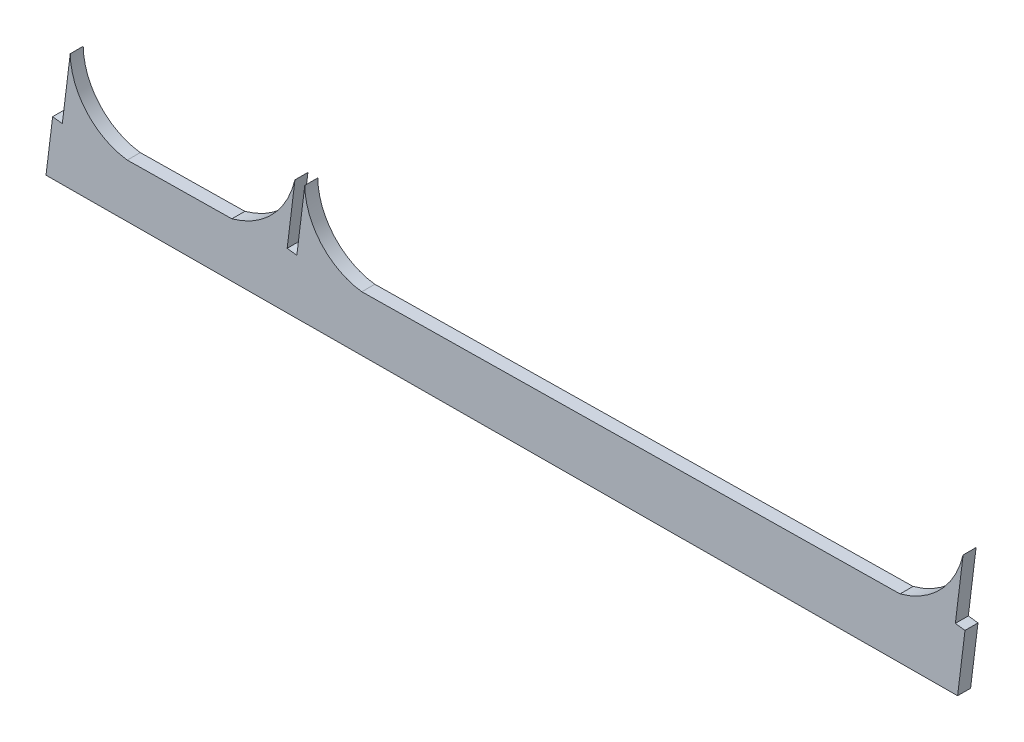
ISO-10303-21;
HEADER;
FILE_DESCRIPTION(('STEP AP214'),'2;1');
FILE_NAME('part.step','',(''),(''),'','','');
FILE_SCHEMA(('AUTOMOTIVE_DESIGN { 1 0 10303 214 1 1 1 1 }'));
ENDSEC;
DATA;
#1=APPLICATION_CONTEXT('core data for automotive mechanical design processes');
#2=APPLICATION_PROTOCOL_DEFINITION('international standard','automotive_design',2000,#1);
#3=PRODUCT_CONTEXT('',#1,'mechanical');
#4=PRODUCT('Part','Part','',(#3));
#5=PRODUCT_RELATED_PRODUCT_CATEGORY('part','',(#4));
#6=PRODUCT_DEFINITION_FORMATION('','',#4);
#7=PRODUCT_DEFINITION_CONTEXT('part definition',#1,'design');
#8=PRODUCT_DEFINITION('design','',#6,#7);
#9=PRODUCT_DEFINITION_SHAPE('','',#8);
#10=(LENGTH_UNIT() NAMED_UNIT(*) SI_UNIT(.MILLI.,.METRE.));
#11=(NAMED_UNIT(*) PLANE_ANGLE_UNIT() SI_UNIT($,.RADIAN.));
#12=(NAMED_UNIT(*) SI_UNIT($,.STERADIAN.) SOLID_ANGLE_UNIT());
#13=UNCERTAINTY_MEASURE_WITH_UNIT(LENGTH_MEASURE(1.E-05),#10,'distance_accuracy_value','');
#14=(GEOMETRIC_REPRESENTATION_CONTEXT(3) GLOBAL_UNCERTAINTY_ASSIGNED_CONTEXT((#13)) GLOBAL_UNIT_ASSIGNED_CONTEXT((#10,
#11,#12)) REPRESENTATION_CONTEXT('',''));
#15=CARTESIAN_POINT('',(0.,0.,0.));
#16=DIRECTION('',(0.,0.,1.));
#17=DIRECTION('',(1.,0.,0.));
#18=AXIS2_PLACEMENT_3D('',#15,#16,#17);
#19=CARTESIAN_POINT('',(27.4838400064507,26.7019259834383,2.));
#20=DIRECTION('',(0.,0.,-1.));
#21=DIRECTION('',(-1.,0.,0.));
#22=AXIS2_PLACEMENT_3D('',#19,#20,#21);
#23=CYLINDRICAL_SURFACE('',#22,9.9999999999998);
#24=CARTESIAN_POINT('',(27.4838400064507,26.7019259834383,0.));
#25=DIRECTION('',(0.,0.,-1.));
#26=DIRECTION('',(1.,0.,0.));
#27=AXIS2_PLACEMENT_3D('',#24,#25,#26);
#28=CIRCLE('',#27,9.9999999999998);
#29=CARTESIAN_POINT('',(26.2651465723992,16.7764644670253,0.));
#30=VERTEX_POINT('',#29);
#31=CARTESIAN_POINT('',(17.4847943354508,26.5637750903717,0.));
#32=VERTEX_POINT('',#31);
#33=EDGE_CURVE('E177',#30,#32,#28,.T.);
#34=ORIENTED_EDGE('',*,*,#33,.T.);
#35=DIRECTION('',(0.,0.,-1.));
#36=VECTOR('',#35,1.);
#37=CARTESIAN_POINT('',(17.4847943354508,26.5637750903717,2.));
#38=LINE('',#37,#36);
#39=CARTESIAN_POINT('',(17.4847943354508,26.5637750903717,2.));
#40=VERTEX_POINT('',#39);
#41=EDGE_CURVE('E11',#40,#32,#38,.T.);
#42=ORIENTED_EDGE('',*,*,#41,.F.);
#43=CARTESIAN_POINT('',(27.4838400064507,26.7019259834383,2.));
#44=DIRECTION('',(0.,0.,-1.));
#45=DIRECTION('',(1.,0.,0.));
#46=AXIS2_PLACEMENT_3D('',#43,#44,#45);
#47=CIRCLE('',#46,9.9999999999998);
#48=CARTESIAN_POINT('',(26.2651465723992,16.7764644670253,2.));
#49=VERTEX_POINT('',#48);
#50=EDGE_CURVE('E207',#49,#40,#47,.T.);
#51=ORIENTED_EDGE('',*,*,#50,.F.);
#52=DIRECTION('',(0.,0.,-1.));
#53=VECTOR('',#52,1.);
#54=CARTESIAN_POINT('',(26.2651465723992,16.7764644670253,2.));
#55=LINE('',#54,#53);
#56=EDGE_CURVE('E173',#49,#30,#55,.T.);
#57=ORIENTED_EDGE('',*,*,#56,.T.);
#58=EDGE_LOOP('',(#34,#42,#51,#57));
#59=FACE_BOUND('',#58,.T.);
#60=ADVANCED_FACE('F33',(#59),#23,.F.);
#61=CARTESIAN_POINT('',(17.4847943354508,26.5637750903717,2.));
#62=DIRECTION('',(0.992546151641322,-0.121869343405149,0.));
#63=DIRECTION('',(0.121869343405149,0.992546151641322,0.));
#64=AXIS2_PLACEMENT_3D('',#61,#62,#63);
#65=PLANE('',#64);
#66=DIRECTION('',(-0.121869343405149,-0.992546151641322,0.));
#67=VECTOR('',#66,1.);
#68=CARTESIAN_POINT('',(17.4847943354508,26.5637750903717,0.));
#69=LINE('',#68,#67);
#70=CARTESIAN_POINT('',(16.2661009013993,16.6383135739585,0.));
#71=VERTEX_POINT('',#70);
#72=EDGE_CURVE('E180',#32,#71,#69,.T.);
#73=ORIENTED_EDGE('',*,*,#72,.T.);
#74=DIRECTION('',(0.,0.,-1.));
#75=VECTOR('',#74,1.);
#76=CARTESIAN_POINT('',(16.2661009013993,16.6383135739585,2.));
#77=LINE('',#76,#75);
#78=CARTESIAN_POINT('',(16.2661009013993,16.6383135739585,2.));
#79=VERTEX_POINT('',#78);
#80=EDGE_CURVE('E41',#79,#71,#77,.T.);
#81=ORIENTED_EDGE('',*,*,#80,.F.);
#82=DIRECTION('',(-0.121869343405149,-0.992546151641322,0.));
#83=VECTOR('',#82,1.);
#84=CARTESIAN_POINT('',(17.4847943354508,26.5637750903717,2.));
#85=LINE('',#84,#83);
#86=EDGE_CURVE('E116',#40,#79,#85,.T.);
#87=ORIENTED_EDGE('',*,*,#86,.F.);
#88=ORIENTED_EDGE('',*,*,#41,.T.);
#89=EDGE_LOOP('',(#73,#81,#87,#88));
#90=FACE_BOUND('',#89,.T.);
#91=ADVANCED_FACE('F305',(#90),#65,.F.);
#92=CARTESIAN_POINT('',(16.2661009013993,16.6383135739585,2.));
#93=DIRECTION('',(-0.121869343405697,-0.992546151641255,0.));
#94=DIRECTION('',(0.992546151641255,-0.121869343405697,0.));
#95=AXIS2_PLACEMENT_3D('',#92,#93,#94);
#96=PLANE('',#95);
#97=DIRECTION('',(-0.992546151641255,0.121869343405697,0.));
#98=VECTOR('',#97,1.);
#99=CARTESIAN_POINT('',(16.2661009013993,16.6383135739585,0.));
#100=LINE('',#99,#98);
#101=CARTESIAN_POINT('',(14.7772816739373,16.8211175890671,0.));
#102=VERTEX_POINT('',#101);
#103=EDGE_CURVE('E182',#71,#102,#100,.T.);
#104=ORIENTED_EDGE('',*,*,#103,.T.);
#105=DIRECTION('',(0.,0.,-1.));
#106=VECTOR('',#105,1.);
#107=CARTESIAN_POINT('',(14.7772816739373,16.8211175890671,2.));
#108=LINE('',#107,#106);
#109=CARTESIAN_POINT('',(14.7772816739373,16.8211175890671,2.));
#110=VERTEX_POINT('',#109);
#111=EDGE_CURVE('E238',#110,#102,#108,.T.);
#112=ORIENTED_EDGE('',*,*,#111,.F.);
#113=DIRECTION('',(-0.992546151641255,0.121869343405697,0.));
#114=VECTOR('',#113,1.);
#115=CARTESIAN_POINT('',(16.2661009013993,16.6383135739585,2.));
#116=LINE('',#115,#114);
#117=EDGE_CURVE('E246',#79,#110,#116,.T.);
#118=ORIENTED_EDGE('',*,*,#117,.F.);
#119=ORIENTED_EDGE('',*,*,#80,.T.);
#120=EDGE_LOOP('',(#104,#112,#118,#119));
#121=FACE_BOUND('',#120,.T.);
#122=ADVANCED_FACE('F244',(#121),#96,.F.);
#123=CARTESIAN_POINT('',(14.7772816739373,16.8211175890671,2.));
#124=DIRECTION('',(0.992546151641322,-0.121869343405147,0.));
#125=DIRECTION('',(0.121869343405147,0.992546151641322,0.));
#126=AXIS2_PLACEMENT_3D('',#123,#124,#125);
#127=PLANE('',#126);
#128=DIRECTION('',(-0.121869343405147,-0.992546151641322,0.));
#129=VECTOR('',#128,1.);
#130=CARTESIAN_POINT('',(14.7772816739373,16.8211175890671,0.));
#131=LINE('',#130,#129);
#132=CARTESIAN_POINT('',(13.7561380350708,8.50457004141588,0.));
#133=VERTEX_POINT('',#132);
#134=EDGE_CURVE('E184',#102,#133,#131,.T.);
#135=ORIENTED_EDGE('',*,*,#134,.T.);
#136=DIRECTION('',(0.,0.,-1.));
#137=VECTOR('',#136,1.);
#138=CARTESIAN_POINT('',(13.7561380350708,8.50457004141588,2.));
#139=LINE('',#138,#137);
#140=CARTESIAN_POINT('',(13.7561380350708,8.50457004141588,2.));
#141=VERTEX_POINT('',#140);
#142=EDGE_CURVE('E235',#141,#133,#139,.T.);
#143=ORIENTED_EDGE('',*,*,#142,.F.);
#144=DIRECTION('',(-0.121869343405147,-0.992546151641322,0.));
#145=VECTOR('',#144,1.);
#146=CARTESIAN_POINT('',(14.7772816739373,16.8211175890671,2.));
#147=LINE('',#146,#145);
#148=EDGE_CURVE('E264',#110,#141,#147,.T.);
#149=ORIENTED_EDGE('',*,*,#148,.F.);
#150=ORIENTED_EDGE('',*,*,#111,.T.);
#151=EDGE_LOOP('',(#135,#143,#149,#150));
#152=FACE_BOUND('',#151,.T.);
#153=ADVANCED_FACE('F255',(#152),#127,.F.);
#154=CARTESIAN_POINT('',(13.7561380350708,8.50457004141588,2.));
#155=DIRECTION('',(-0.00545790160296681,0.999985105544124,0.));
#156=DIRECTION('',(-0.999985105544124,-0.00545790160296681,0.));
#157=AXIS2_PLACEMENT_3D('',#154,#155,#156);
#158=PLANE('',#157);
#159=DIRECTION('',(0.999985105544124,0.00545790160296681,0.));
#160=VECTOR('',#159,1.);
#161=CARTESIAN_POINT('',(13.7561380350708,8.50457004141588,0.));
#162=LINE('',#161,#160);
#163=CARTESIAN_POINT('',(154.085282897782,9.27048411397839,0.));
#164=VERTEX_POINT('',#163);
#165=EDGE_CURVE('E186',#133,#164,#162,.T.);
#166=ORIENTED_EDGE('',*,*,#165,.T.);
#167=DIRECTION('',(0.,0.,-1.));
#168=VECTOR('',#167,1.);
#169=CARTESIAN_POINT('',(154.085282897782,9.27048411397839,2.));
#170=LINE('',#169,#168);
#171=CARTESIAN_POINT('',(154.085282897782,9.27048411397839,2.));
#172=VERTEX_POINT('',#171);
#173=EDGE_CURVE('E232',#172,#164,#170,.T.);
#174=ORIENTED_EDGE('',*,*,#173,.F.);
#175=DIRECTION('',(0.999985105544124,0.00545790160296681,0.));
#176=VECTOR('',#175,1.);
#177=CARTESIAN_POINT('',(13.7561380350708,8.50457004141588,2.));
#178=LINE('',#177,#176);
#179=EDGE_CURVE('E261',#141,#172,#178,.T.);
#180=ORIENTED_EDGE('',*,*,#179,.F.);
#181=ORIENTED_EDGE('',*,*,#142,.T.);
#182=EDGE_LOOP('',(#166,#174,#180,#181));
#183=FACE_BOUND('',#182,.T.);
#184=ADVANCED_FACE('F259',(#183),#158,.F.);
#185=CARTESIAN_POINT('',(155.225675401659,18.5582357294194,2.));
#186=DIRECTION('',(-0.992546151641323,0.121869343405143,0.));
#187=DIRECTION('',(-0.121869343405143,-0.992546151641323,0.));
#188=AXIS2_PLACEMENT_3D('',#185,#186,#187);
#189=PLANE('',#188);
#190=DIRECTION('',(0.121869343405143,0.992546151641323,0.));
#191=VECTOR('',#190,1.);
#192=CARTESIAN_POINT('',(155.225675401659,18.5582357294194,0.));
#193=LINE('',#192,#191);
#194=CARTESIAN_POINT('',(155.225675401659,18.5582357294194,0.));
#195=VERTEX_POINT('',#194);
#196=EDGE_CURVE('E188',#164,#195,#193,.T.);
#197=ORIENTED_EDGE('',*,*,#196,.T.);
#198=DIRECTION('',(0.,0.,-1.));
#199=VECTOR('',#198,1.);
#200=CARTESIAN_POINT('',(155.225675401659,18.5582357294194,2.));
#201=LINE('',#200,#199);
#202=CARTESIAN_POINT('',(155.225675401659,18.5582357294194,2.));
#203=VERTEX_POINT('',#202);
#204=EDGE_CURVE('E229',#203,#195,#201,.T.);
#205=ORIENTED_EDGE('',*,*,#204,.F.);
#206=DIRECTION('',(0.121869343405143,0.992546151641323,0.));
#207=VECTOR('',#206,1.);
#208=CARTESIAN_POINT('',(155.225675401659,18.5582357294194,2.));
#209=LINE('',#208,#207);
#210=EDGE_CURVE('E263',#172,#203,#209,.T.);
#211=ORIENTED_EDGE('',*,*,#210,.F.);
#212=ORIENTED_EDGE('',*,*,#173,.T.);
#213=EDGE_LOOP('',(#197,#205,#211,#212));
#214=FACE_BOUND('',#213,.T.);
#215=ADVANCED_FACE('F318',(#214),#189,.F.);
#216=CARTESIAN_POINT('',(155.225675401659,18.5582357294194,2.));
#217=DIRECTION('',(-0.121869343405157,-0.992546151641321,0.));
#218=DIRECTION('',(0.992546151641321,-0.121869343405157,0.));
#219=AXIS2_PLACEMENT_3D('',#216,#217,#218);
#220=PLANE('',#219);
#221=DIRECTION('',(-0.992546151641321,0.121869343405157,0.));
#222=VECTOR('',#221,1.);
#223=CARTESIAN_POINT('',(155.225675401659,18.5582357294194,0.));
#224=LINE('',#223,#222);
#225=CARTESIAN_POINT('',(153.736856174199,18.7410397445269,0.));
#226=VERTEX_POINT('',#225);
#227=EDGE_CURVE('E190',#195,#226,#224,.T.);
#228=ORIENTED_EDGE('',*,*,#227,.T.);
#229=DIRECTION('',(0.,0.,-1.));
#230=VECTOR('',#229,1.);
#231=CARTESIAN_POINT('',(153.736856174199,18.7410397445269,2.));
#232=LINE('',#231,#230);
#233=CARTESIAN_POINT('',(153.736856174199,18.7410397445269,2.));
#234=VERTEX_POINT('',#233);
#235=EDGE_CURVE('E226',#234,#226,#232,.T.);
#236=ORIENTED_EDGE('',*,*,#235,.F.);
#237=DIRECTION('',(-0.992546151641321,0.121869343405157,0.));
#238=VECTOR('',#237,1.);
#239=CARTESIAN_POINT('',(155.225675401659,18.5582357294194,2.));
#240=LINE('',#239,#238);
#241=EDGE_CURVE('E266',#203,#234,#240,.T.);
#242=ORIENTED_EDGE('',*,*,#241,.F.);
#243=ORIENTED_EDGE('',*,*,#204,.T.);
#244=EDGE_LOOP('',(#228,#236,#242,#243));
#245=FACE_BOUND('',#244,.T.);
#246=ADVANCED_FACE('F321',(#245),#220,.F.);
#247=CARTESIAN_POINT('',(154.930535968518,28.4627815135302,2.));
#248=DIRECTION('',(-0.992546151641322,0.121869343405151,0.));
#249=DIRECTION('',(-0.121869343405151,-0.992546151641322,0.));
#250=AXIS2_PLACEMENT_3D('',#247,#248,#249);
#251=PLANE('',#250);
#252=DIRECTION('',(0.121869343405151,0.992546151641322,0.));
#253=VECTOR('',#252,1.);
#254=CARTESIAN_POINT('',(154.930535968518,28.4627815135302,0.));
#255=LINE('',#254,#253);
#256=CARTESIAN_POINT('',(154.930535968518,28.4627815135302,0.));
#257=VERTEX_POINT('',#256);
#258=EDGE_CURVE('E192',#226,#257,#255,.T.);
#259=ORIENTED_EDGE('',*,*,#258,.T.);
#260=DIRECTION('',(0.,0.,-1.));
#261=VECTOR('',#260,1.);
#262=CARTESIAN_POINT('',(154.930535968518,28.4627815135302,2.));
#263=LINE('',#262,#261);
#264=CARTESIAN_POINT('',(154.930535968518,28.4627815135302,2.));
#265=VERTEX_POINT('',#264);
#266=EDGE_CURVE('E223',#265,#257,#263,.T.);
#267=ORIENTED_EDGE('',*,*,#266,.F.);
#268=DIRECTION('',(0.121869343405151,0.992546151641322,0.));
#269=VECTOR('',#268,1.);
#270=CARTESIAN_POINT('',(154.930535968518,28.4627815135302,2.));
#271=LINE('',#270,#269);
#272=EDGE_CURVE('E272',#234,#265,#271,.T.);
#273=ORIENTED_EDGE('',*,*,#272,.F.);
#274=ORIENTED_EDGE('',*,*,#235,.T.);
#275=EDGE_LOOP('',(#259,#267,#273,#274));
#276=FACE_BOUND('',#275,.T.);
#277=ADVANCED_FACE('F325',(#276),#251,.F.);
#278=CARTESIAN_POINT('',(141.610831824647,31.6235245626371,2.));
#279=DIRECTION('',(0.,0.,-1.));
#280=DIRECTION('',(-1.,0.,0.));
#281=AXIS2_PLACEMENT_3D('',#278,#279,#280);
#282=CYLINDRICAL_SURFACE('',#281,13.6895878353855);
#283=CARTESIAN_POINT('',(141.610831824647,31.6235245626371,0.));
#284=DIRECTION('',(0.,0.,-1.));
#285=DIRECTION('',(1.,0.,0.));
#286=AXIS2_PLACEMENT_3D('',#283,#284,#285);
#287=CIRCLE('',#286,13.6895878353855);
#288=CARTESIAN_POINT('',(145.226629730662,18.4200848363541,0.));
#289=VERTEX_POINT('',#288);
#290=EDGE_CURVE('E194',#257,#289,#287,.T.);
#291=ORIENTED_EDGE('',*,*,#290,.T.);
#292=DIRECTION('',(0.,0.,-1.));
#293=VECTOR('',#292,1.);
#294=CARTESIAN_POINT('',(145.226629730662,18.4200848363541,2.));
#295=LINE('',#294,#293);
#296=CARTESIAN_POINT('',(145.226629730662,18.4200848363541,2.));
#297=VERTEX_POINT('',#296);
#298=EDGE_CURVE('E220',#297,#289,#295,.T.);
#299=ORIENTED_EDGE('',*,*,#298,.F.);
#300=CARTESIAN_POINT('',(141.610831824647,31.6235245626371,2.));
#301=DIRECTION('',(0.,0.,-1.));
#302=DIRECTION('',(1.,0.,0.));
#303=AXIS2_PLACEMENT_3D('',#300,#301,#302);
#304=CIRCLE('',#303,13.6895878353855);
#305=EDGE_CURVE('E274',#265,#297,#304,.T.);
#306=ORIENTED_EDGE('',*,*,#305,.F.);
#307=ORIENTED_EDGE('',*,*,#266,.T.);
#308=EDGE_LOOP('',(#291,#299,#306,#307));
#309=FACE_BOUND('',#308,.T.);
#310=ADVANCED_FACE('F329',(#309),#282,.F.);
#311=CARTESIAN_POINT('',(62.3697126579389,17.2752998771804,2.));
#312=DIRECTION('',(0.0138150893065506,-0.999904567100007,0.));
#313=DIRECTION('',(0.999904567100007,0.0138150893065506,0.));
#314=AXIS2_PLACEMENT_3D('',#311,#312,#313);
#315=PLANE('',#314);
#316=DIRECTION('',(-0.999904567100007,-0.0138150893065506,0.));
#317=VECTOR('',#316,1.);
#318=CARTESIAN_POINT('',(62.3697126579389,17.2752998771804,0.));
#319=LINE('',#318,#317);
#320=CARTESIAN_POINT('',(62.3697126579389,17.2752998771804,0.));
#321=VERTEX_POINT('',#320);
#322=EDGE_CURVE('E196',#289,#321,#319,.T.);
#323=ORIENTED_EDGE('',*,*,#322,.T.);
#324=DIRECTION('',(0.,0.,-1.));
#325=VECTOR('',#324,1.);
#326=CARTESIAN_POINT('',(62.3697126579389,17.2752998771804,2.));
#327=LINE('',#326,#325);
#328=CARTESIAN_POINT('',(62.3697126579389,17.2752998771804,2.));
#329=VERTEX_POINT('',#328);
#330=EDGE_CURVE('E217',#329,#321,#327,.T.);
#331=ORIENTED_EDGE('',*,*,#330,.F.);
#332=DIRECTION('',(-0.999904567100007,-0.0138150893065506,0.));
#333=VECTOR('',#332,1.);
#334=CARTESIAN_POINT('',(62.3697126579389,17.2752998771804,2.));
#335=LINE('',#334,#333);
#336=EDGE_CURVE('E276',#297,#329,#335,.T.);
#337=ORIENTED_EDGE('',*,*,#336,.F.);
#338=ORIENTED_EDGE('',*,*,#298,.T.);
#339=EDGE_LOOP('',(#323,#331,#337,#338));
#340=FACE_BOUND('',#339,.T.);
#341=ADVANCED_FACE('F333',(#340),#315,.F.);
#342=CARTESIAN_POINT('',(63.5884060919903,27.2007613935934,2.));
#343=DIRECTION('',(0.,0.,-1.));
#344=DIRECTION('',(-1.,0.,0.));
#345=AXIS2_PLACEMENT_3D('',#342,#343,#344);
#346=CYLINDRICAL_SURFACE('',#345,9.9999999999998);
#347=CARTESIAN_POINT('',(63.5884060919903,27.2007613935934,0.));
#348=DIRECTION('',(0.,0.,-1.));
#349=DIRECTION('',(1.,0.,0.));
#350=AXIS2_PLACEMENT_3D('',#347,#348,#349);
#351=CIRCLE('',#350,9.9999999999998);
#352=CARTESIAN_POINT('',(53.5893604209905,27.0626105005269,0.));
#353=VERTEX_POINT('',#352);
#354=EDGE_CURVE('E198',#321,#353,#351,.T.);
#355=ORIENTED_EDGE('',*,*,#354,.T.);
#356=DIRECTION('',(0.,0.,-1.));
#357=VECTOR('',#356,1.);
#358=CARTESIAN_POINT('',(53.5893604209905,27.0626105005269,2.));
#359=LINE('',#358,#357);
#360=CARTESIAN_POINT('',(53.5893604209905,27.0626105005269,2.));
#361=VERTEX_POINT('',#360);
#362=EDGE_CURVE('E214',#361,#353,#359,.T.);
#363=ORIENTED_EDGE('',*,*,#362,.F.);
#364=CARTESIAN_POINT('',(63.5884060919903,27.2007613935934,2.));
#365=DIRECTION('',(0.,0.,-1.));
#366=DIRECTION('',(1.,0.,0.));
#367=AXIS2_PLACEMENT_3D('',#364,#365,#366);
#368=CIRCLE('',#367,9.9999999999998);
#369=EDGE_CURVE('E278',#329,#361,#368,.T.);
#370=ORIENTED_EDGE('',*,*,#369,.F.);
#371=ORIENTED_EDGE('',*,*,#330,.T.);
#372=EDGE_LOOP('',(#355,#363,#370,#371));
#373=FACE_BOUND('',#372,.T.);
#374=ADVANCED_FACE('F337',(#373),#346,.F.);
#375=CARTESIAN_POINT('',(53.5893604209905,27.0626105005269,2.));
#376=DIRECTION('',(0.992546151641322,-0.121869343405149,0.));
#377=DIRECTION('',(0.121869343405149,0.992546151641322,0.));
#378=AXIS2_PLACEMENT_3D('',#375,#376,#377);
#379=PLANE('',#378);
#380=DIRECTION('',(-0.121869343405149,-0.992546151641322,0.));
#381=VECTOR('',#380,1.);
#382=CARTESIAN_POINT('',(53.5893604209905,27.0626105005269,0.));
#383=LINE('',#382,#381);
#384=CARTESIAN_POINT('',(52.370666986939,17.1371489841137,0.));
#385=VERTEX_POINT('',#384);
#386=EDGE_CURVE('E200',#353,#385,#383,.T.);
#387=ORIENTED_EDGE('',*,*,#386,.T.);
#388=DIRECTION('',(0.,0.,-1.));
#389=VECTOR('',#388,1.);
#390=CARTESIAN_POINT('',(52.370666986939,17.1371489841137,2.));
#391=LINE('',#390,#389);
#392=CARTESIAN_POINT('',(52.370666986939,17.1371489841137,2.));
#393=VERTEX_POINT('',#392);
#394=EDGE_CURVE('E211',#393,#385,#391,.T.);
#395=ORIENTED_EDGE('',*,*,#394,.F.);
#396=DIRECTION('',(-0.121869343405149,-0.992546151641322,0.));
#397=VECTOR('',#396,1.);
#398=CARTESIAN_POINT('',(53.5893604209905,27.0626105005269,2.));
#399=LINE('',#398,#397);
#400=EDGE_CURVE('E280',#361,#393,#399,.T.);
#401=ORIENTED_EDGE('',*,*,#400,.F.);
#402=ORIENTED_EDGE('',*,*,#362,.T.);
#403=EDGE_LOOP('',(#387,#395,#401,#402));
#404=FACE_BOUND('',#403,.T.);
#405=ADVANCED_FACE('F286',(#404),#379,.F.);
#406=CARTESIAN_POINT('',(52.370666986939,17.1371489841137,2.));
#407=DIRECTION('',(-0.121869343406,-0.992546151641217,0.));
#408=DIRECTION('',(0.992546151641218,-0.121869343406,0.));
#409=AXIS2_PLACEMENT_3D('',#406,#407,#408);
#410=PLANE('',#409);
#411=DIRECTION('',(-0.992546151641217,0.121869343406,0.));
#412=VECTOR('',#411,1.);
#413=CARTESIAN_POINT('',(52.370666986939,17.1371489841137,0.));
#414=LINE('',#413,#412);
#415=CARTESIAN_POINT('',(50.881847759477,17.3199529992227,0.));
#416=VERTEX_POINT('',#415);
#417=EDGE_CURVE('E202',#385,#416,#414,.T.);
#418=ORIENTED_EDGE('',*,*,#417,.T.);
#419=DIRECTION('',(0.,0.,-1.));
#420=VECTOR('',#419,1.);
#421=CARTESIAN_POINT('',(50.881847759477,17.3199529992227,2.));
#422=LINE('',#421,#420);
#423=CARTESIAN_POINT('',(50.881847759477,17.3199529992227,2.));
#424=VERTEX_POINT('',#423);
#425=EDGE_CURVE('E168',#424,#416,#422,.T.);
#426=ORIENTED_EDGE('',*,*,#425,.F.);
#427=DIRECTION('',(-0.992546151641217,0.121869343406,0.));
#428=VECTOR('',#427,1.);
#429=CARTESIAN_POINT('',(52.370666986939,17.1371489841137,2.));
#430=LINE('',#429,#428);
#431=EDGE_CURVE('E159',#393,#424,#430,.T.);
#432=ORIENTED_EDGE('',*,*,#431,.F.);
#433=ORIENTED_EDGE('',*,*,#394,.T.);
#434=EDGE_LOOP('',(#418,#426,#432,#433));
#435=FACE_BOUND('',#434,.T.);
#436=ADVANCED_FACE('F290',(#435),#410,.F.);
#437=CARTESIAN_POINT('',(52.0755275537949,27.041694768226,2.));
#438=DIRECTION('',(-0.99254615164133,0.121869343405084,0.));
#439=DIRECTION('',(-0.121869343405084,-0.99254615164133,0.));
#440=AXIS2_PLACEMENT_3D('',#437,#438,#439);
#441=PLANE('',#440);
#442=DIRECTION('',(0.121869343405084,0.99254615164133,0.));
#443=VECTOR('',#442,1.);
#444=CARTESIAN_POINT('',(52.0755275537949,27.041694768226,0.));
#445=LINE('',#444,#443);
#446=CARTESIAN_POINT('',(52.0755275537949,27.041694768226,0.));
#447=VERTEX_POINT('',#446);
#448=EDGE_CURVE('E167',#416,#447,#445,.T.);
#449=ORIENTED_EDGE('',*,*,#448,.T.);
#450=DIRECTION('',(0.,0.,-1.));
#451=VECTOR('',#450,1.);
#452=CARTESIAN_POINT('',(52.0755275537949,27.041694768226,2.));
#453=LINE('',#452,#451);
#454=CARTESIAN_POINT('',(52.0755275537949,27.041694768226,2.));
#455=VERTEX_POINT('',#454);
#456=EDGE_CURVE('E164',#455,#447,#453,.T.);
#457=ORIENTED_EDGE('',*,*,#456,.F.);
#458=DIRECTION('',(0.121869343405084,0.99254615164133,0.));
#459=VECTOR('',#458,1.);
#460=CARTESIAN_POINT('',(52.0755275537949,27.041694768226,2.));
#461=LINE('',#460,#459);
#462=EDGE_CURVE('E153',#424,#455,#461,.T.);
#463=ORIENTED_EDGE('',*,*,#462,.F.);
#464=ORIENTED_EDGE('',*,*,#425,.T.);
#465=EDGE_LOOP('',(#449,#457,#463,#464));
#466=FACE_BOUND('',#465,.T.);
#467=ADVANCED_FACE('F165',(#466),#441,.F.);
#468=CARTESIAN_POINT('',(38.7558234099238,30.2024378173327,2.));
#469=DIRECTION('',(0.,0.,-1.));
#470=DIRECTION('',(-1.,0.,0.));
#471=AXIS2_PLACEMENT_3D('',#468,#469,#470);
#472=CYLINDRICAL_SURFACE('',#471,13.6895878353855);
#473=CARTESIAN_POINT('',(38.7558234099238,30.2024378173327,0.));
#474=DIRECTION('',(0.,0.,-1.));
#475=DIRECTION('',(1.,0.,0.));
#476=AXIS2_PLACEMENT_3D('',#473,#474,#475);
#477=CIRCLE('',#476,13.6895878353855);
#478=CARTESIAN_POINT('',(42.3716213159392,16.9989980910497,0.));
#479=VERTEX_POINT('',#478);
#480=EDGE_CURVE('E102',#447,#479,#477,.T.);
#481=ORIENTED_EDGE('',*,*,#480,.T.);
#482=DIRECTION('',(0.,0.,-1.));
#483=VECTOR('',#482,1.);
#484=CARTESIAN_POINT('',(42.3716213159392,16.9989980910497,2.));
#485=LINE('',#484,#483);
#486=CARTESIAN_POINT('',(42.3716213159392,16.9989980910497,2.));
#487=VERTEX_POINT('',#486);
#488=EDGE_CURVE('E169',#487,#479,#485,.T.);
#489=ORIENTED_EDGE('',*,*,#488,.F.);
#490=CARTESIAN_POINT('',(38.7558234099238,30.2024378173327,2.));
#491=DIRECTION('',(0.,0.,-1.));
#492=DIRECTION('',(1.,0.,0.));
#493=AXIS2_PLACEMENT_3D('',#490,#491,#492);
#494=CIRCLE('',#493,13.6895878353855);
#495=EDGE_CURVE('E157',#455,#487,#494,.T.);
#496=ORIENTED_EDGE('',*,*,#495,.F.);
#497=ORIENTED_EDGE('',*,*,#456,.T.);
#498=EDGE_LOOP('',(#481,#489,#496,#497));
#499=FACE_BOUND('',#498,.T.);
#500=ADVANCED_FACE('F171',(#499),#472,.F.);
#501=CARTESIAN_POINT('',(26.2651465723992,16.7764644670253,2.));
#502=DIRECTION('',(0.0138150893065285,-0.999904567100007,0.));
#503=DIRECTION('',(0.999904567100007,0.0138150893065285,0.));
#504=AXIS2_PLACEMENT_3D('',#501,#502,#503);
#505=PLANE('',#504);
#506=DIRECTION('',(-0.999904567100007,-0.0138150893065285,0.));
#507=VECTOR('',#506,1.);
#508=CARTESIAN_POINT('',(26.2651465723992,16.7764644670253,0.));
#509=LINE('',#508,#507);
#510=EDGE_CURVE('E108',#479,#30,#509,.T.);
#511=ORIENTED_EDGE('',*,*,#510,.T.);
#512=ORIENTED_EDGE('',*,*,#56,.F.);
#513=DIRECTION('',(-0.999904567100007,-0.0138150893065285,0.));
#514=VECTOR('',#513,1.);
#515=CARTESIAN_POINT('',(26.2651465723992,16.7764644670253,2.));
#516=LINE('',#515,#514);
#517=EDGE_CURVE('E49',#487,#49,#516,.T.);
#518=ORIENTED_EDGE('',*,*,#517,.F.);
#519=ORIENTED_EDGE('',*,*,#488,.T.);
#520=EDGE_LOOP('',(#511,#512,#518,#519));
#521=FACE_BOUND('',#520,.T.);
#522=ADVANCED_FACE('F294',(#521),#505,.F.);
#523=CARTESIAN_POINT('',(27.4838400064507,26.7019259834383,2.));
#524=DIRECTION('',(0.,0.,1.));
#525=DIRECTION('',(1.,0.,0.));
#526=AXIS2_PLACEMENT_3D('',#523,#524,#525);
#527=PLANE('',#526);
#528=ORIENTED_EDGE('',*,*,#50,.T.);
#529=ORIENTED_EDGE('',*,*,#86,.T.);
#530=ORIENTED_EDGE('',*,*,#117,.T.);
#531=ORIENTED_EDGE('',*,*,#148,.T.);
#532=ORIENTED_EDGE('',*,*,#179,.T.);
#533=ORIENTED_EDGE('',*,*,#210,.T.);
#534=ORIENTED_EDGE('',*,*,#241,.T.);
#535=ORIENTED_EDGE('',*,*,#272,.T.);
#536=ORIENTED_EDGE('',*,*,#305,.T.);
#537=ORIENTED_EDGE('',*,*,#336,.T.);
#538=ORIENTED_EDGE('',*,*,#369,.T.);
#539=ORIENTED_EDGE('',*,*,#400,.T.);
#540=ORIENTED_EDGE('',*,*,#431,.T.);
#541=ORIENTED_EDGE('',*,*,#462,.T.);
#542=ORIENTED_EDGE('',*,*,#495,.T.);
#543=ORIENTED_EDGE('',*,*,#517,.T.);
#544=EDGE_LOOP('',(#528,#529,#530,#531,#532,#533,#534,#535,#536,#537,#538,#539,#540,#541,#542,#543));
#545=FACE_BOUND('',#544,.T.);
#546=ADVANCED_FACE('F155',(#545),#527,.T.);
#547=CARTESIAN_POINT('',(27.4838400064507,26.7019259834383,0.));
#548=DIRECTION('',(0.,0.,1.));
#549=DIRECTION('',(1.,0.,0.));
#550=AXIS2_PLACEMENT_3D('',#547,#548,#549);
#551=PLANE('',#550);
#552=ORIENTED_EDGE('',*,*,#33,.F.);
#553=ORIENTED_EDGE('',*,*,#510,.F.);
#554=ORIENTED_EDGE('',*,*,#480,.F.);
#555=ORIENTED_EDGE('',*,*,#448,.F.);
#556=ORIENTED_EDGE('',*,*,#417,.F.);
#557=ORIENTED_EDGE('',*,*,#386,.F.);
#558=ORIENTED_EDGE('',*,*,#354,.F.);
#559=ORIENTED_EDGE('',*,*,#322,.F.);
#560=ORIENTED_EDGE('',*,*,#290,.F.);
#561=ORIENTED_EDGE('',*,*,#258,.F.);
#562=ORIENTED_EDGE('',*,*,#227,.F.);
#563=ORIENTED_EDGE('',*,*,#196,.F.);
#564=ORIENTED_EDGE('',*,*,#165,.F.);
#565=ORIENTED_EDGE('',*,*,#134,.F.);
#566=ORIENTED_EDGE('',*,*,#103,.F.);
#567=ORIENTED_EDGE('',*,*,#72,.F.);
#568=EDGE_LOOP('',(#552,#553,#554,#555,#556,#557,#558,#559,#560,#561,#562,#563,#564,#565,#566,#567));
#569=FACE_BOUND('',#568,.T.);
#570=ADVANCED_FACE('F250',(#569),#551,.F.);
#571=CLOSED_SHELL('',(#60,#91,#122,#153,#184,#215,#246,#277,#310,#341,#374,#405,#436,#467,#500,
#522,#546,#570));
#572=MANIFOLD_SOLID_BREP('B2',#571);
#573=ADVANCED_BREP_SHAPE_REPRESENTATION('',(#18,#572),#14);
#574=SHAPE_DEFINITION_REPRESENTATION(#9,#573);
ENDSEC;
END-ISO-10303-21;
